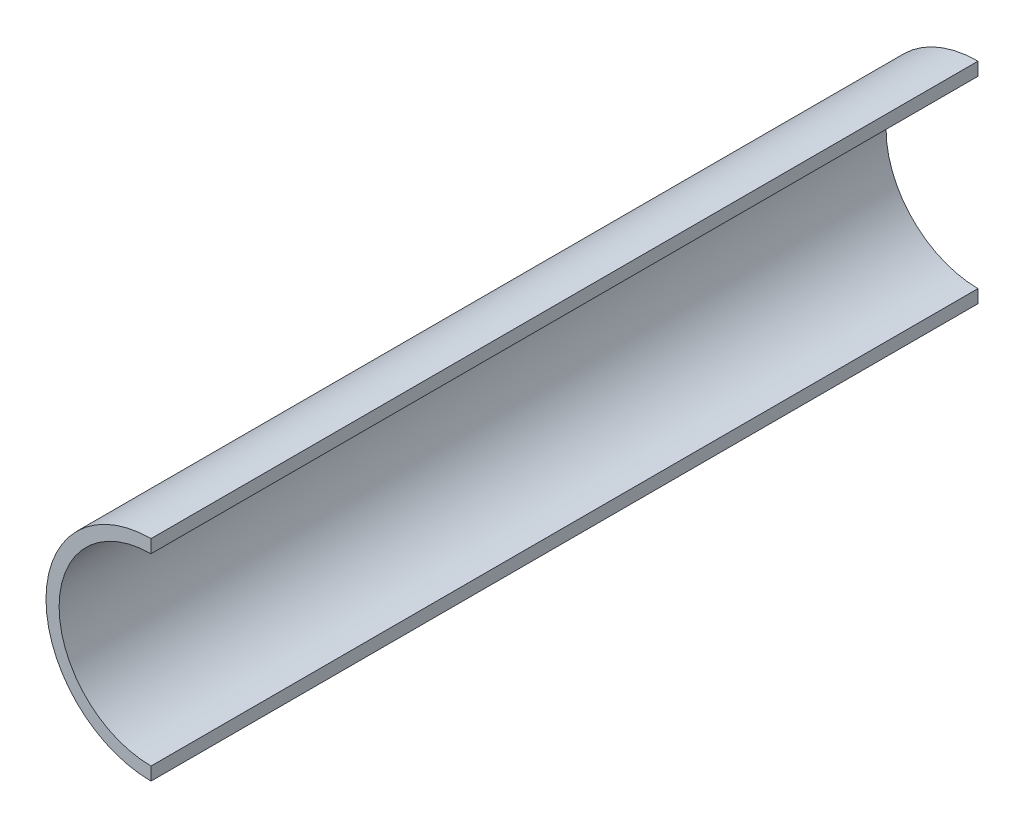
ISO-10303-21;
HEADER;
FILE_DESCRIPTION(('STEP AP214'),'2;1');
FILE_NAME('part.step','',(''),(''),'','','');
FILE_SCHEMA(('AUTOMOTIVE_DESIGN { 1 0 10303 214 1 1 1 1 }'));
ENDSEC;
DATA;
#1=APPLICATION_CONTEXT('core data for automotive mechanical design processes');
#2=APPLICATION_PROTOCOL_DEFINITION('international standard','automotive_design',2000,#1);
#3=PRODUCT_CONTEXT('',#1,'mechanical');
#4=PRODUCT('Part','Part','',(#3));
#5=PRODUCT_RELATED_PRODUCT_CATEGORY('part','',(#4));
#6=PRODUCT_DEFINITION_FORMATION('','',#4);
#7=PRODUCT_DEFINITION_CONTEXT('part definition',#1,'design');
#8=PRODUCT_DEFINITION('design','',#6,#7);
#9=PRODUCT_DEFINITION_SHAPE('','',#8);
#10=(LENGTH_UNIT() NAMED_UNIT(*) SI_UNIT(.MILLI.,.METRE.));
#11=(NAMED_UNIT(*) PLANE_ANGLE_UNIT() SI_UNIT($,.RADIAN.));
#12=(NAMED_UNIT(*) SI_UNIT($,.STERADIAN.) SOLID_ANGLE_UNIT());
#13=UNCERTAINTY_MEASURE_WITH_UNIT(LENGTH_MEASURE(1.E-05),#10,'distance_accuracy_value','');
#14=(GEOMETRIC_REPRESENTATION_CONTEXT(3) GLOBAL_UNCERTAINTY_ASSIGNED_CONTEXT((#13)) GLOBAL_UNIT_ASSIGNED_CONTEXT((#10,
#11,#12)) REPRESENTATION_CONTEXT('',''));
#15=CARTESIAN_POINT('',(0.,0.,0.));
#16=DIRECTION('',(0.,0.,1.));
#17=DIRECTION('',(1.,0.,0.));
#18=AXIS2_PLACEMENT_3D('',#15,#16,#17);
#19=CARTESIAN_POINT('',(0.,0.,200.));
#20=DIRECTION('',(0.,0.,-1.));
#21=DIRECTION('',(-1.,0.,0.));
#22=AXIS2_PLACEMENT_3D('',#19,#20,#21);
#23=CYLINDRICAL_SURFACE('',#22,25.4);
#24=CARTESIAN_POINT('',(0.,0.,0.));
#25=DIRECTION('',(0.,0.,1.));
#26=DIRECTION('',(1.,0.,0.));
#27=AXIS2_PLACEMENT_3D('',#24,#25,#26);
#28=CIRCLE('',#27,25.4);
#29=CARTESIAN_POINT('',(0.,25.4,0.));
#30=VERTEX_POINT('',#29);
#31=CARTESIAN_POINT('',(0.,-25.4,0.));
#32=VERTEX_POINT('',#31);
#33=EDGE_CURVE('E100',#30,#32,#28,.T.);
#34=ORIENTED_EDGE('',*,*,#33,.T.);
#35=DIRECTION('',(0.,0.,-1.));
#36=VECTOR('',#35,1.);
#37=CARTESIAN_POINT('',(0.,-25.4,200.));
#38=LINE('',#37,#36);
#39=CARTESIAN_POINT('',(0.,-25.4,200.));
#40=VERTEX_POINT('',#39);
#41=EDGE_CURVE('E11',#40,#32,#38,.T.);
#42=ORIENTED_EDGE('',*,*,#41,.F.);
#43=CARTESIAN_POINT('',(0.,0.,200.));
#44=DIRECTION('',(0.,0.,1.));
#45=DIRECTION('',(1.,0.,0.));
#46=AXIS2_PLACEMENT_3D('',#43,#44,#45);
#47=CIRCLE('',#46,25.4);
#48=CARTESIAN_POINT('',(0.,25.4,200.));
#49=VERTEX_POINT('',#48);
#50=EDGE_CURVE('E88',#49,#40,#47,.T.);
#51=ORIENTED_EDGE('',*,*,#50,.F.);
#52=DIRECTION('',(0.,0.,-1.));
#53=VECTOR('',#52,1.);
#54=CARTESIAN_POINT('',(0.,25.4,200.));
#55=LINE('',#54,#53);
#56=EDGE_CURVE('E96',#49,#30,#55,.T.);
#57=ORIENTED_EDGE('',*,*,#56,.T.);
#58=EDGE_LOOP('',(#34,#42,#51,#57));
#59=FACE_BOUND('',#58,.T.);
#60=ADVANCED_FACE('F37',(#59),#23,.T.);
#61=CARTESIAN_POINT('',(0.,-25.4,200.));
#62=DIRECTION('',(-1.,0.,0.));
#63=DIRECTION('',(0.,0.,1.));
#64=AXIS2_PLACEMENT_3D('',#61,#62,#63);
#65=PLANE('',#64);
#66=DIRECTION('',(0.,1.,0.));
#67=VECTOR('',#66,1.);
#68=CARTESIAN_POINT('',(0.,-25.4,0.));
#69=LINE('',#68,#67);
#70=CARTESIAN_POINT('',(0.,-22.23,0.));
#71=VERTEX_POINT('',#70);
#72=EDGE_CURVE('E92',#32,#71,#69,.T.);
#73=ORIENTED_EDGE('',*,*,#72,.T.);
#74=DIRECTION('',(0.,0.,-1.));
#75=VECTOR('',#74,1.);
#76=CARTESIAN_POINT('',(0.,-22.23,200.));
#77=LINE('',#76,#75);
#78=CARTESIAN_POINT('',(0.,-22.23,200.));
#79=VERTEX_POINT('',#78);
#80=EDGE_CURVE('E45',#79,#71,#77,.T.);
#81=ORIENTED_EDGE('',*,*,#80,.F.);
#82=DIRECTION('',(0.,1.,0.));
#83=VECTOR('',#82,1.);
#84=CARTESIAN_POINT('',(0.,-25.4,200.));
#85=LINE('',#84,#83);
#86=EDGE_CURVE('E83',#40,#79,#85,.T.);
#87=ORIENTED_EDGE('',*,*,#86,.F.);
#88=ORIENTED_EDGE('',*,*,#41,.T.);
#89=EDGE_LOOP('',(#73,#81,#87,#88));
#90=FACE_BOUND('',#89,.T.);
#91=ADVANCED_FACE('F91',(#90),#65,.F.);
#92=CARTESIAN_POINT('',(0.,0.,200.));
#93=DIRECTION('',(0.,0.,-1.));
#94=DIRECTION('',(-1.,0.,0.));
#95=AXIS2_PLACEMENT_3D('',#92,#93,#94);
#96=CYLINDRICAL_SURFACE('',#95,22.23);
#97=CARTESIAN_POINT('',(0.,0.,0.));
#98=DIRECTION('',(0.,0.,-1.));
#99=DIRECTION('',(1.,0.,0.));
#100=AXIS2_PLACEMENT_3D('',#97,#98,#99);
#101=CIRCLE('',#100,22.23);
#102=CARTESIAN_POINT('',(0.,22.23,0.));
#103=VERTEX_POINT('',#102);
#104=EDGE_CURVE('E70',#71,#103,#101,.T.);
#105=ORIENTED_EDGE('',*,*,#104,.T.);
#106=DIRECTION('',(0.,0.,-1.));
#107=VECTOR('',#106,1.);
#108=CARTESIAN_POINT('',(0.,22.23,200.));
#109=LINE('',#108,#107);
#110=CARTESIAN_POINT('',(0.,22.23,200.));
#111=VERTEX_POINT('',#110);
#112=EDGE_CURVE('E93',#111,#103,#109,.T.);
#113=ORIENTED_EDGE('',*,*,#112,.F.);
#114=CARTESIAN_POINT('',(0.,0.,200.));
#115=DIRECTION('',(0.,0.,-1.));
#116=DIRECTION('',(1.,0.,0.));
#117=AXIS2_PLACEMENT_3D('',#114,#115,#116);
#118=CIRCLE('',#117,22.23);
#119=EDGE_CURVE('E86',#79,#111,#118,.T.);
#120=ORIENTED_EDGE('',*,*,#119,.F.);
#121=ORIENTED_EDGE('',*,*,#80,.T.);
#122=EDGE_LOOP('',(#105,#113,#120,#121));
#123=FACE_BOUND('',#122,.T.);
#124=ADVANCED_FACE('F94',(#123),#96,.F.);
#125=CARTESIAN_POINT('',(0.,22.23,200.));
#126=DIRECTION('',(-1.,0.,0.));
#127=DIRECTION('',(0.,0.,1.));
#128=AXIS2_PLACEMENT_3D('',#125,#126,#127);
#129=PLANE('',#128);
#130=DIRECTION('',(0.,1.,0.));
#131=VECTOR('',#130,1.);
#132=CARTESIAN_POINT('',(0.,22.23,0.));
#133=LINE('',#132,#131);
#134=EDGE_CURVE('E76',#103,#30,#133,.T.);
#135=ORIENTED_EDGE('',*,*,#134,.T.);
#136=ORIENTED_EDGE('',*,*,#56,.F.);
#137=DIRECTION('',(0.,1.,0.));
#138=VECTOR('',#137,1.);
#139=CARTESIAN_POINT('',(0.,22.23,200.));
#140=LINE('',#139,#138);
#141=EDGE_CURVE('E53',#111,#49,#140,.T.);
#142=ORIENTED_EDGE('',*,*,#141,.F.);
#143=ORIENTED_EDGE('',*,*,#112,.T.);
#144=EDGE_LOOP('',(#135,#136,#142,#143));
#145=FACE_BOUND('',#144,.T.);
#146=ADVANCED_FACE('F107',(#145),#129,.F.);
#147=CARTESIAN_POINT('',(0.,0.,200.));
#148=DIRECTION('',(0.,0.,1.));
#149=DIRECTION('',(1.,0.,0.));
#150=AXIS2_PLACEMENT_3D('',#147,#148,#149);
#151=PLANE('',#150);
#152=ORIENTED_EDGE('',*,*,#50,.T.);
#153=ORIENTED_EDGE('',*,*,#86,.T.);
#154=ORIENTED_EDGE('',*,*,#119,.T.);
#155=ORIENTED_EDGE('',*,*,#141,.T.);
#156=EDGE_LOOP('',(#152,#153,#154,#155));
#157=FACE_BOUND('',#156,.T.);
#158=ADVANCED_FACE('F84',(#157),#151,.T.);
#159=CARTESIAN_POINT('',(0.,0.,0.));
#160=DIRECTION('',(0.,0.,1.));
#161=DIRECTION('',(1.,0.,0.));
#162=AXIS2_PLACEMENT_3D('',#159,#160,#161);
#163=PLANE('',#162);
#164=ORIENTED_EDGE('',*,*,#33,.F.);
#165=ORIENTED_EDGE('',*,*,#134,.F.);
#166=ORIENTED_EDGE('',*,*,#104,.F.);
#167=ORIENTED_EDGE('',*,*,#72,.F.);
#168=EDGE_LOOP('',(#164,#165,#166,#167));
#169=FACE_BOUND('',#168,.T.);
#170=ADVANCED_FACE('F110',(#169),#163,.F.);
#171=CLOSED_SHELL('',(#60,#91,#124,#146,#158,#170));
#172=MANIFOLD_SOLID_BREP('B2',#171);
#173=ADVANCED_BREP_SHAPE_REPRESENTATION('',(#18,#172),#14);
#174=SHAPE_DEFINITION_REPRESENTATION(#9,#173);
ENDSEC;
END-ISO-10303-21;
